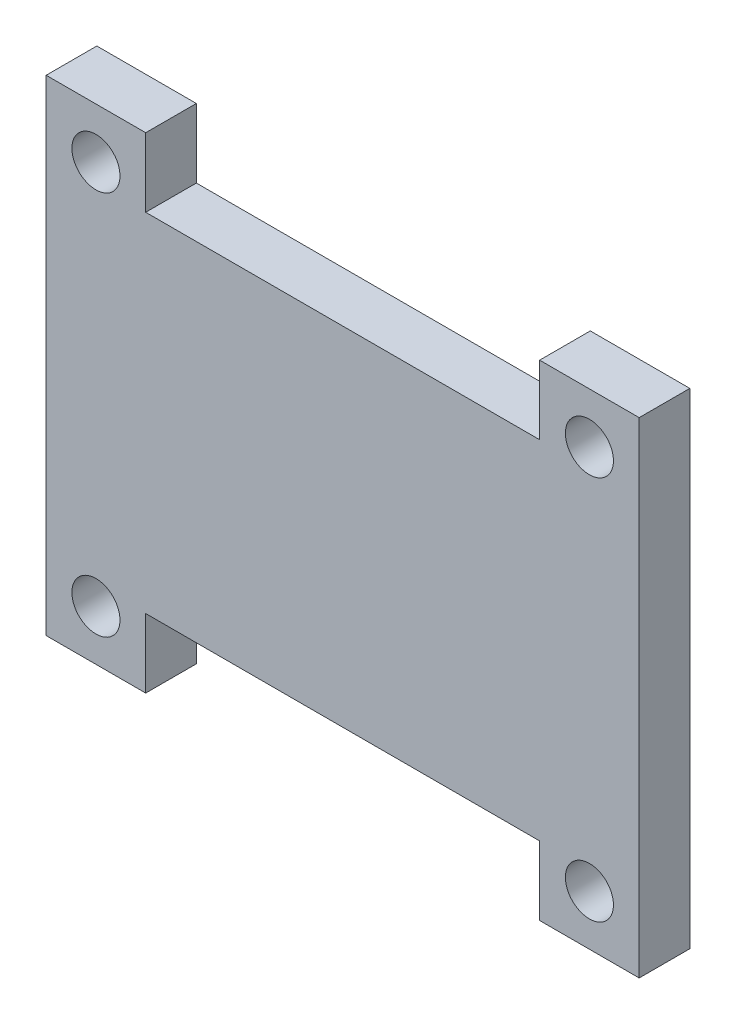
ISO-10303-21;
HEADER;
FILE_DESCRIPTION(('STEP AP214'),'2;1');
FILE_NAME('part.step','',(''),(''),'','','');
FILE_SCHEMA(('AUTOMOTIVE_DESIGN { 1 0 10303 214 1 1 1 1 }'));
ENDSEC;
DATA;
#1=APPLICATION_CONTEXT('core data for automotive mechanical design processes');
#2=APPLICATION_PROTOCOL_DEFINITION('international standard','automotive_design',2000,#1);
#3=PRODUCT_CONTEXT('',#1,'mechanical');
#4=PRODUCT('Part','Part','',(#3));
#5=PRODUCT_RELATED_PRODUCT_CATEGORY('part','',(#4));
#6=PRODUCT_DEFINITION_FORMATION('','',#4);
#7=PRODUCT_DEFINITION_CONTEXT('part definition',#1,'design');
#8=PRODUCT_DEFINITION('design','',#6,#7);
#9=PRODUCT_DEFINITION_SHAPE('','',#8);
#10=(LENGTH_UNIT() NAMED_UNIT(*) SI_UNIT(.MILLI.,.METRE.));
#11=(NAMED_UNIT(*) PLANE_ANGLE_UNIT() SI_UNIT($,.RADIAN.));
#12=(NAMED_UNIT(*) SI_UNIT($,.STERADIAN.) SOLID_ANGLE_UNIT());
#13=UNCERTAINTY_MEASURE_WITH_UNIT(LENGTH_MEASURE(1.E-05),#10,'distance_accuracy_value','');
#14=(GEOMETRIC_REPRESENTATION_CONTEXT(3) GLOBAL_UNCERTAINTY_ASSIGNED_CONTEXT((#13)) GLOBAL_UNIT_ASSIGNED_CONTEXT((#10,
#11,#12)) REPRESENTATION_CONTEXT('',''));
#15=CARTESIAN_POINT('',(0.,0.,0.));
#16=DIRECTION('',(0.,0.,1.));
#17=DIRECTION('',(1.,0.,0.));
#18=AXIS2_PLACEMENT_3D('',#15,#16,#17);
#19=CARTESIAN_POINT('',(-25.,-19.4444444444444,1.58));
#20=DIRECTION('',(0.,0.,1.));
#21=DIRECTION('',(1.,0.,0.));
#22=AXIS2_PLACEMENT_3D('',#19,#20,#21);
#23=PLANE('',#22);
#24=CARTESIAN_POINT('',(-8.0525,-17.8744444444445,1.58));
#25=DIRECTION('',(0.,0.,-1.));
#26=DIRECTION('',(0.,1.,0.));
#27=AXIS2_PLACEMENT_3D('',#24,#25,#26);
#28=CIRCLE('',#27,0.750000000000003);
#29=CARTESIAN_POINT('',(-8.0525,-17.1244444444445,1.58));
#30=VERTEX_POINT('',#29);
#31=EDGE_CURVE('E138',#30,#30,#28,.F.);
#32=ORIENTED_EDGE('',*,*,#31,.F.);
#33=EDGE_LOOP('',(#32));
#34=FACE_BOUND('',#33,.T.);
#35=CARTESIAN_POINT('',(-8.0525,-5.87444444444445,1.58));
#36=DIRECTION('',(0.,0.,-1.));
#37=DIRECTION('',(0.,1.,0.));
#38=AXIS2_PLACEMENT_3D('',#35,#36,#37);
#39=CIRCLE('',#38,0.750000000000003);
#40=CARTESIAN_POINT('',(-8.0525,-5.12444444444445,1.58));
#41=VERTEX_POINT('',#40);
#42=EDGE_CURVE('E142',#41,#41,#39,.F.);
#43=ORIENTED_EDGE('',*,*,#42,.F.);
#44=EDGE_LOOP('',(#43));
#45=FACE_BOUND('',#44,.T.);
#46=CARTESIAN_POINT('',(-23.4475,-17.8744444444445,1.58));
#47=DIRECTION('',(0.,0.,1.));
#48=DIRECTION('',(0.,-1.,0.));
#49=AXIS2_PLACEMENT_3D('',#46,#47,#48);
#50=CIRCLE('',#49,0.750000000000004);
#51=CARTESIAN_POINT('',(-23.4475,-18.6244444444445,1.58));
#52=VERTEX_POINT('',#51);
#53=EDGE_CURVE('E144',#52,#52,#50,.T.);
#54=ORIENTED_EDGE('',*,*,#53,.F.);
#55=EDGE_LOOP('',(#54));
#56=FACE_BOUND('',#55,.T.);
#57=CARTESIAN_POINT('',(-23.4475,-5.87444444444445,1.58));
#58=DIRECTION('',(0.,0.,1.));
#59=DIRECTION('',(0.,-1.,0.));
#60=AXIS2_PLACEMENT_3D('',#57,#58,#59);
#61=CIRCLE('',#60,0.750000000000004);
#62=CARTESIAN_POINT('',(-23.4475,-6.62444444444445,1.58));
#63=VERTEX_POINT('',#62);
#64=EDGE_CURVE('E20',#63,#63,#61,.T.);
#65=ORIENTED_EDGE('',*,*,#64,.F.);
#66=EDGE_LOOP('',(#65));
#67=FACE_BOUND('',#66,.T.);
#68=DIRECTION('',(0.,-1.,0.));
#69=VECTOR('',#68,1.);
#70=CARTESIAN_POINT('',(-6.5,-11.8744444444445,1.58));
#71=LINE('',#70,#69);
#72=CARTESIAN_POINT('',(-6.5,-4.30444444444445,1.58));
#73=VERTEX_POINT('',#72);
#74=CARTESIAN_POINT('',(-6.5,-19.4444444444444,1.58));
#75=VERTEX_POINT('',#74);
#76=EDGE_CURVE('E103',#73,#75,#71,.T.);
#77=ORIENTED_EDGE('',*,*,#76,.F.);
#78=DIRECTION('',(1.,0.,0.));
#79=VECTOR('',#78,1.);
#80=CARTESIAN_POINT('',(-8.0525,-4.30444444444445,1.58));
#81=LINE('',#80,#79);
#82=CARTESIAN_POINT('',(-9.60500000000001,-4.30444444444445,1.58));
#83=VERTEX_POINT('',#82);
#84=EDGE_CURVE('E118',#83,#73,#81,.T.);
#85=ORIENTED_EDGE('',*,*,#84,.F.);
#86=DIRECTION('',(0.,1.,0.));
#87=VECTOR('',#86,1.);
#88=CARTESIAN_POINT('',(-9.605,-5.37944444444445,1.57999999999999));
#89=LINE('',#88,#87);
#90=CARTESIAN_POINT('',(-9.60500000000002,-6.45444444444446,1.58));
#91=VERTEX_POINT('',#90);
#92=EDGE_CURVE('E108',#91,#83,#89,.T.);
#93=ORIENTED_EDGE('',*,*,#92,.F.);
#94=DIRECTION('',(1.,0.,0.));
#95=VECTOR('',#94,1.);
#96=CARTESIAN_POINT('',(-15.75,-6.45444444444445,1.58));
#97=LINE('',#96,#95);
#98=CARTESIAN_POINT('',(-21.895,-6.45444444444446,1.58));
#99=VERTEX_POINT('',#98);
#100=EDGE_CURVE('E151',#99,#91,#97,.T.);
#101=ORIENTED_EDGE('',*,*,#100,.F.);
#102=DIRECTION('',(0.,-1.,0.));
#103=VECTOR('',#102,1.);
#104=CARTESIAN_POINT('',(-21.895,-5.37944444444445,1.58));
#105=LINE('',#104,#103);
#106=CARTESIAN_POINT('',(-21.895,-4.30444444444445,1.58));
#107=VERTEX_POINT('',#106);
#108=EDGE_CURVE('E160',#107,#99,#105,.T.);
#109=ORIENTED_EDGE('',*,*,#108,.F.);
#110=DIRECTION('',(1.,0.,0.));
#111=VECTOR('',#110,1.);
#112=CARTESIAN_POINT('',(-23.4475,-4.30444444444445,1.58));
#113=LINE('',#112,#111);
#114=CARTESIAN_POINT('',(-25.,-4.30444444444445,1.58));
#115=VERTEX_POINT('',#114);
#116=EDGE_CURVE('E165',#115,#107,#113,.T.);
#117=ORIENTED_EDGE('',*,*,#116,.F.);
#118=DIRECTION('',(0.,1.,0.));
#119=VECTOR('',#118,1.);
#120=CARTESIAN_POINT('',(-25.,-11.8744444444445,1.58));
#121=LINE('',#120,#119);
#122=CARTESIAN_POINT('',(-25.,-19.4444444444444,1.58));
#123=VERTEX_POINT('',#122);
#124=EDGE_CURVE('E173',#123,#115,#121,.T.);
#125=ORIENTED_EDGE('',*,*,#124,.F.);
#126=DIRECTION('',(-1.,0.,0.));
#127=VECTOR('',#126,1.);
#128=CARTESIAN_POINT('',(-23.4475,-19.4444444444444,1.58));
#129=LINE('',#128,#127);
#130=CARTESIAN_POINT('',(-21.895,-19.4444444444444,1.57999999999999));
#131=VERTEX_POINT('',#130);
#132=EDGE_CURVE('E175',#131,#123,#129,.T.);
#133=ORIENTED_EDGE('',*,*,#132,.F.);
#134=DIRECTION('',(0.,-1.,0.));
#135=VECTOR('',#134,1.);
#136=CARTESIAN_POINT('',(-21.895,-18.3694444444444,1.57999999999997));
#137=LINE('',#136,#135);
#138=CARTESIAN_POINT('',(-21.895,-17.2944444444444,1.57999999999999));
#139=VERTEX_POINT('',#138);
#140=EDGE_CURVE('E181',#139,#131,#137,.T.);
#141=ORIENTED_EDGE('',*,*,#140,.F.);
#142=DIRECTION('',(-1.,0.,0.));
#143=VECTOR('',#142,1.);
#144=CARTESIAN_POINT('',(-15.75,-17.2944444444445,1.58));
#145=LINE('',#144,#143);
#146=CARTESIAN_POINT('',(-9.60500000000001,-17.2944444444444,1.57999999999998));
#147=VERTEX_POINT('',#146);
#148=EDGE_CURVE('E186',#147,#139,#145,.T.);
#149=ORIENTED_EDGE('',*,*,#148,.F.);
#150=DIRECTION('',(0.,1.,0.));
#151=VECTOR('',#150,1.);
#152=CARTESIAN_POINT('',(-9.605,-18.3694444444445,1.57999999999996));
#153=LINE('',#152,#151);
#154=CARTESIAN_POINT('',(-9.60500000000001,-19.4444444444444,1.57999999999999));
#155=VERTEX_POINT('',#154);
#156=EDGE_CURVE('E191',#155,#147,#153,.T.);
#157=ORIENTED_EDGE('',*,*,#156,.F.);
#158=DIRECTION('',(-1.,0.,0.));
#159=VECTOR('',#158,1.);
#160=CARTESIAN_POINT('',(-8.0525,-19.4444444444444,1.58));
#161=LINE('',#160,#159);
#162=EDGE_CURVE('E196',#75,#155,#161,.T.);
#163=ORIENTED_EDGE('',*,*,#162,.F.);
#164=EDGE_LOOP('',(#77,#85,#93,#101,#109,#117,#125,#133,#141,#149,#157,#163));
#165=FACE_BOUND('',#164,.T.);
#166=ADVANCED_FACE('F17',(#34,#45,#56,#67,#165),#23,.T.);
#167=CARTESIAN_POINT('',(-9.605,-6.45444444444445,1.57999999999999));
#168=DIRECTION('',(-1.,0.,0.));
#169=DIRECTION('',(0.,1.,0.));
#170=AXIS2_PLACEMENT_3D('',#167,#168,#169);
#171=PLANE('',#170);
#172=ORIENTED_EDGE('',*,*,#92,.T.);
#173=DIRECTION('',(0.,0.,1.));
#174=VECTOR('',#173,1.);
#175=CARTESIAN_POINT('',(-9.605,-4.30444444444445,0.));
#176=LINE('',#175,#174);
#177=CARTESIAN_POINT('',(-9.605,-4.30444444444445,0.));
#178=VERTEX_POINT('',#177);
#179=EDGE_CURVE('E111',#178,#83,#176,.T.);
#180=ORIENTED_EDGE('',*,*,#179,.F.);
#181=DIRECTION('',(0.,1.,0.));
#182=VECTOR('',#181,1.);
#183=CARTESIAN_POINT('',(-9.605,-19.4444444444444,0.));
#184=LINE('',#183,#182);
#185=CARTESIAN_POINT('',(-9.605,-6.45444444444445,0.));
#186=VERTEX_POINT('',#185);
#187=EDGE_CURVE('E141',#186,#178,#184,.T.);
#188=ORIENTED_EDGE('',*,*,#187,.F.);
#189=DIRECTION('',(0.,0.,-1.));
#190=VECTOR('',#189,1.);
#191=CARTESIAN_POINT('',(-9.605,-6.45444444444445,1.58));
#192=LINE('',#191,#190);
#193=EDGE_CURVE('E114',#91,#186,#192,.T.);
#194=ORIENTED_EDGE('',*,*,#193,.F.);
#195=EDGE_LOOP('',(#172,#180,#188,#194));
#196=FACE_BOUND('',#195,.T.);
#197=ADVANCED_FACE('F109',(#196),#171,.T.);
#198=CARTESIAN_POINT('',(-6.5,-4.30444444444445,0.));
#199=DIRECTION('',(0.,1.,0.));
#200=DIRECTION('',(-1.,0.,0.));
#201=AXIS2_PLACEMENT_3D('',#198,#199,#200);
#202=PLANE('',#201);
#203=DIRECTION('',(0.,0.,1.));
#204=VECTOR('',#203,1.);
#205=CARTESIAN_POINT('',(-6.5,-4.30444444444445,0.));
#206=LINE('',#205,#204);
#207=CARTESIAN_POINT('',(-6.5,-4.30444444444445,0.));
#208=VERTEX_POINT('',#207);
#209=EDGE_CURVE('E201',#208,#73,#206,.T.);
#210=ORIENTED_EDGE('',*,*,#209,.F.);
#211=DIRECTION('',(1.,0.,0.));
#212=VECTOR('',#211,1.);
#213=CARTESIAN_POINT('',(-15.75,-4.30444444444445,0.));
#214=LINE('',#213,#212);
#215=EDGE_CURVE('E124',#178,#208,#214,.T.);
#216=ORIENTED_EDGE('',*,*,#215,.F.);
#217=ORIENTED_EDGE('',*,*,#179,.T.);
#218=ORIENTED_EDGE('',*,*,#84,.T.);
#219=EDGE_LOOP('',(#210,#216,#217,#218));
#220=FACE_BOUND('',#219,.T.);
#221=ADVANCED_FACE('F122',(#220),#202,.T.);
#222=CARTESIAN_POINT('',(-6.5,-19.4444444444444,0.));
#223=DIRECTION('',(1.,0.,0.));
#224=DIRECTION('',(0.,1.,0.));
#225=AXIS2_PLACEMENT_3D('',#222,#223,#224);
#226=PLANE('',#225);
#227=DIRECTION('',(0.,1.,0.));
#228=VECTOR('',#227,1.);
#229=CARTESIAN_POINT('',(-6.5,-19.4444444444444,0.));
#230=LINE('',#229,#228);
#231=CARTESIAN_POINT('',(-6.5,-19.4444444444444,0.));
#232=VERTEX_POINT('',#231);
#233=EDGE_CURVE('E217',#208,#232,#230,.F.);
#234=ORIENTED_EDGE('',*,*,#233,.F.);
#235=ORIENTED_EDGE('',*,*,#209,.T.);
#236=ORIENTED_EDGE('',*,*,#76,.T.);
#237=DIRECTION('',(0.,0.,1.));
#238=VECTOR('',#237,1.);
#239=CARTESIAN_POINT('',(-6.5,-19.4444444444444,0.));
#240=LINE('',#239,#238);
#241=EDGE_CURVE('E198',#232,#75,#240,.T.);
#242=ORIENTED_EDGE('',*,*,#241,.F.);
#243=EDGE_LOOP('',(#234,#235,#236,#242));
#244=FACE_BOUND('',#243,.T.);
#245=ADVANCED_FACE('F204',(#244),#226,.T.);
#246=CARTESIAN_POINT('',(-9.605,-19.4444444444444,0.));
#247=DIRECTION('',(0.,-1.,0.));
#248=DIRECTION('',(1.,0.,0.));
#249=AXIS2_PLACEMENT_3D('',#246,#247,#248);
#250=PLANE('',#249);
#251=ORIENTED_EDGE('',*,*,#241,.T.);
#252=ORIENTED_EDGE('',*,*,#162,.T.);
#253=DIRECTION('',(0.,0.,-1.));
#254=VECTOR('',#253,1.);
#255=CARTESIAN_POINT('',(-9.605,-19.4444444444444,1.58000000000001));
#256=LINE('',#255,#254);
#257=CARTESIAN_POINT('',(-9.605,-19.4444444444444,0.));
#258=VERTEX_POINT('',#257);
#259=EDGE_CURVE('E193',#258,#155,#256,.F.);
#260=ORIENTED_EDGE('',*,*,#259,.F.);
#261=DIRECTION('',(-1.,0.,0.));
#262=VECTOR('',#261,1.);
#263=CARTESIAN_POINT('',(-15.75,-19.4444444444444,0.));
#264=LINE('',#263,#262);
#265=EDGE_CURVE('E211',#232,#258,#264,.T.);
#266=ORIENTED_EDGE('',*,*,#265,.F.);
#267=EDGE_LOOP('',(#251,#252,#260,#266));
#268=FACE_BOUND('',#267,.T.);
#269=ADVANCED_FACE('F209',(#268),#250,.T.);
#270=CARTESIAN_POINT('',(-9.605,-19.4444444444444,1.57999999999997));
#271=DIRECTION('',(-1.,0.,0.));
#272=DIRECTION('',(0.,1.,0.));
#273=AXIS2_PLACEMENT_3D('',#270,#271,#272);
#274=PLANE('',#273);
#275=ORIENTED_EDGE('',*,*,#156,.T.);
#276=DIRECTION('',(0.,0.,-1.));
#277=VECTOR('',#276,1.);
#278=CARTESIAN_POINT('',(-9.605,-17.2944444444445,1.58));
#279=LINE('',#278,#277);
#280=CARTESIAN_POINT('',(-9.605,-17.2944444444445,0.));
#281=VERTEX_POINT('',#280);
#282=EDGE_CURVE('E188',#281,#147,#279,.F.);
#283=ORIENTED_EDGE('',*,*,#282,.F.);
#284=DIRECTION('',(0.,1.,0.));
#285=VECTOR('',#284,1.);
#286=CARTESIAN_POINT('',(-9.605,-19.4444444444444,0.));
#287=LINE('',#286,#285);
#288=EDGE_CURVE('E216',#258,#281,#287,.T.);
#289=ORIENTED_EDGE('',*,*,#288,.F.);
#290=ORIENTED_EDGE('',*,*,#259,.T.);
#291=EDGE_LOOP('',(#275,#283,#289,#290));
#292=FACE_BOUND('',#291,.T.);
#293=ADVANCED_FACE('F263',(#292),#274,.T.);
#294=CARTESIAN_POINT('',(-9.605,-17.2944444444445,1.58));
#295=DIRECTION('',(0.,-1.,0.));
#296=DIRECTION('',(-1.,0.,0.));
#297=AXIS2_PLACEMENT_3D('',#294,#295,#296);
#298=PLANE('',#297);
#299=ORIENTED_EDGE('',*,*,#148,.T.);
#300=DIRECTION('',(0.,0.,-1.));
#301=VECTOR('',#300,1.);
#302=CARTESIAN_POINT('',(-21.895,-17.2944444444445,1.57999999999999));
#303=LINE('',#302,#301);
#304=CARTESIAN_POINT('',(-21.895,-17.2944444444445,0.));
#305=VERTEX_POINT('',#304);
#306=EDGE_CURVE('E183',#305,#139,#303,.F.);
#307=ORIENTED_EDGE('',*,*,#306,.F.);
#308=DIRECTION('',(-1.,0.,0.));
#309=VECTOR('',#308,1.);
#310=CARTESIAN_POINT('',(-15.75,-17.2944444444445,0.));
#311=LINE('',#310,#309);
#312=EDGE_CURVE('E224',#281,#305,#311,.T.);
#313=ORIENTED_EDGE('',*,*,#312,.F.);
#314=ORIENTED_EDGE('',*,*,#282,.T.);
#315=EDGE_LOOP('',(#299,#307,#313,#314));
#316=FACE_BOUND('',#315,.T.);
#317=ADVANCED_FACE('F261',(#316),#298,.T.);
#318=CARTESIAN_POINT('',(-21.895,-17.2944444444445,1.57999999999997));
#319=DIRECTION('',(1.,0.,0.));
#320=DIRECTION('',(0.,-1.,0.));
#321=AXIS2_PLACEMENT_3D('',#318,#319,#320);
#322=PLANE('',#321);
#323=ORIENTED_EDGE('',*,*,#140,.T.);
#324=DIRECTION('',(0.,0.,1.));
#325=VECTOR('',#324,1.);
#326=CARTESIAN_POINT('',(-21.895,-19.4444444444444,0.));
#327=LINE('',#326,#325);
#328=CARTESIAN_POINT('',(-21.895,-19.4444444444444,0.));
#329=VERTEX_POINT('',#328);
#330=EDGE_CURVE('E178',#329,#131,#327,.T.);
#331=ORIENTED_EDGE('',*,*,#330,.F.);
#332=DIRECTION('',(0.,1.,0.));
#333=VECTOR('',#332,1.);
#334=CARTESIAN_POINT('',(-21.895,-19.4444444444444,0.));
#335=LINE('',#334,#333);
#336=EDGE_CURVE('E227',#305,#329,#335,.F.);
#337=ORIENTED_EDGE('',*,*,#336,.F.);
#338=ORIENTED_EDGE('',*,*,#306,.T.);
#339=EDGE_LOOP('',(#323,#331,#337,#338));
#340=FACE_BOUND('',#339,.T.);
#341=ADVANCED_FACE('F258',(#340),#322,.T.);
#342=CARTESIAN_POINT('',(-25.,-19.4444444444444,0.));
#343=DIRECTION('',(0.,-1.,0.));
#344=DIRECTION('',(1.,0.,0.));
#345=AXIS2_PLACEMENT_3D('',#342,#343,#344);
#346=PLANE('',#345);
#347=DIRECTION('',(0.,0.,1.));
#348=VECTOR('',#347,1.);
#349=CARTESIAN_POINT('',(-25.,-19.4444444444444,0.));
#350=LINE('',#349,#348);
#351=CARTESIAN_POINT('',(-25.,-19.4444444444444,0.));
#352=VERTEX_POINT('',#351);
#353=EDGE_CURVE('E170',#352,#123,#350,.T.);
#354=ORIENTED_EDGE('',*,*,#353,.F.);
#355=DIRECTION('',(-1.,0.,0.));
#356=VECTOR('',#355,1.);
#357=CARTESIAN_POINT('',(-15.75,-19.4444444444444,0.));
#358=LINE('',#357,#356);
#359=EDGE_CURVE('E230',#329,#352,#358,.T.);
#360=ORIENTED_EDGE('',*,*,#359,.F.);
#361=ORIENTED_EDGE('',*,*,#330,.T.);
#362=ORIENTED_EDGE('',*,*,#132,.T.);
#363=EDGE_LOOP('',(#354,#360,#361,#362));
#364=FACE_BOUND('',#363,.T.);
#365=ADVANCED_FACE('F254',(#364),#346,.T.);
#366=CARTESIAN_POINT('',(-25.,-4.30444444444445,0.));
#367=DIRECTION('',(-1.,0.,0.));
#368=DIRECTION('',(0.,-1.,0.));
#369=AXIS2_PLACEMENT_3D('',#366,#367,#368);
#370=PLANE('',#369);
#371=DIRECTION('',(0.,1.,0.));
#372=VECTOR('',#371,1.);
#373=CARTESIAN_POINT('',(-25.,-19.4444444444444,0.));
#374=LINE('',#373,#372);
#375=CARTESIAN_POINT('',(-25.,-4.30444444444445,0.));
#376=VERTEX_POINT('',#375);
#377=EDGE_CURVE('E233',#352,#376,#374,.T.);
#378=ORIENTED_EDGE('',*,*,#377,.F.);
#379=ORIENTED_EDGE('',*,*,#353,.T.);
#380=ORIENTED_EDGE('',*,*,#124,.T.);
#381=DIRECTION('',(0.,0.,1.));
#382=VECTOR('',#381,1.);
#383=CARTESIAN_POINT('',(-25.,-4.30444444444445,0.));
#384=LINE('',#383,#382);
#385=EDGE_CURVE('E167',#376,#115,#384,.T.);
#386=ORIENTED_EDGE('',*,*,#385,.F.);
#387=EDGE_LOOP('',(#378,#379,#380,#386));
#388=FACE_BOUND('',#387,.T.);
#389=ADVANCED_FACE('F250',(#388),#370,.T.);
#390=CARTESIAN_POINT('',(-21.895,-4.30444444444445,0.));
#391=DIRECTION('',(0.,1.,0.));
#392=DIRECTION('',(-1.,0.,0.));
#393=AXIS2_PLACEMENT_3D('',#390,#391,#392);
#394=PLANE('',#393);
#395=ORIENTED_EDGE('',*,*,#385,.T.);
#396=ORIENTED_EDGE('',*,*,#116,.T.);
#397=DIRECTION('',(0.,0.,-1.));
#398=VECTOR('',#397,1.);
#399=CARTESIAN_POINT('',(-21.895,-4.30444444444445,1.58000000000001));
#400=LINE('',#399,#398);
#401=CARTESIAN_POINT('',(-21.895,-4.30444444444445,0.));
#402=VERTEX_POINT('',#401);
#403=EDGE_CURVE('E162',#402,#107,#400,.F.);
#404=ORIENTED_EDGE('',*,*,#403,.F.);
#405=DIRECTION('',(1.,0.,0.));
#406=VECTOR('',#405,1.);
#407=CARTESIAN_POINT('',(-15.75,-4.30444444444445,0.));
#408=LINE('',#407,#406);
#409=EDGE_CURVE('E236',#376,#402,#408,.T.);
#410=ORIENTED_EDGE('',*,*,#409,.F.);
#411=EDGE_LOOP('',(#395,#396,#404,#410));
#412=FACE_BOUND('',#411,.T.);
#413=ADVANCED_FACE('F247',(#412),#394,.T.);
#414=CARTESIAN_POINT('',(-21.895,-4.30444444444445,1.58000000000001));
#415=DIRECTION('',(1.,0.,0.));
#416=DIRECTION('',(0.,-1.,0.));
#417=AXIS2_PLACEMENT_3D('',#414,#415,#416);
#418=PLANE('',#417);
#419=ORIENTED_EDGE('',*,*,#108,.T.);
#420=DIRECTION('',(0.,0.,-1.));
#421=VECTOR('',#420,1.);
#422=CARTESIAN_POINT('',(-21.895,-6.45444444444445,1.58));
#423=LINE('',#422,#421);
#424=CARTESIAN_POINT('',(-21.895,-6.45444444444445,0.));
#425=VERTEX_POINT('',#424);
#426=EDGE_CURVE('E35',#425,#99,#423,.F.);
#427=ORIENTED_EDGE('',*,*,#426,.F.);
#428=DIRECTION('',(0.,1.,0.));
#429=VECTOR('',#428,1.);
#430=CARTESIAN_POINT('',(-21.895,-19.4444444444444,0.));
#431=LINE('',#430,#429);
#432=EDGE_CURVE('E239',#402,#425,#431,.F.);
#433=ORIENTED_EDGE('',*,*,#432,.F.);
#434=ORIENTED_EDGE('',*,*,#403,.T.);
#435=EDGE_LOOP('',(#419,#427,#433,#434));
#436=FACE_BOUND('',#435,.T.);
#437=ADVANCED_FACE('F244',(#436),#418,.T.);
#438=CARTESIAN_POINT('',(-21.895,-6.45444444444445,1.58));
#439=DIRECTION('',(0.,1.,0.));
#440=DIRECTION('',(1.,0.,0.));
#441=AXIS2_PLACEMENT_3D('',#438,#439,#440);
#442=PLANE('',#441);
#443=ORIENTED_EDGE('',*,*,#100,.T.);
#444=ORIENTED_EDGE('',*,*,#193,.T.);
#445=DIRECTION('',(1.,0.,0.));
#446=VECTOR('',#445,1.);
#447=CARTESIAN_POINT('',(-15.75,-6.45444444444445,0.));
#448=LINE('',#447,#446);
#449=EDGE_CURVE('E137',#425,#186,#448,.T.);
#450=ORIENTED_EDGE('',*,*,#449,.F.);
#451=ORIENTED_EDGE('',*,*,#426,.T.);
#452=EDGE_LOOP('',(#443,#444,#450,#451));
#453=FACE_BOUND('',#452,.T.);
#454=ADVANCED_FACE('F241',(#453),#442,.T.);
#455=CARTESIAN_POINT('',(-23.4475,-5.87444444444446,0.));
#456=DIRECTION('',(0.,0.,1.));
#457=DIRECTION('',(0.,-1.,0.));
#458=AXIS2_PLACEMENT_3D('',#455,#456,#457);
#459=CYLINDRICAL_SURFACE('',#458,0.750000000000004);
#460=CARTESIAN_POINT('',(-23.4475,-5.87444444444446,0.));
#461=DIRECTION('',(0.,0.,1.));
#462=DIRECTION('',(0.,-1.,0.));
#463=AXIS2_PLACEMENT_3D('',#460,#461,#462);
#464=CIRCLE('',#463,0.750000000000004);
#465=CARTESIAN_POINT('',(-23.4475,-6.62444444444446,0.));
#466=VERTEX_POINT('',#465);
#467=EDGE_CURVE('E134',#466,#466,#464,.T.);
#468=ORIENTED_EDGE('',*,*,#467,.F.);
#469=EDGE_LOOP('',(#468));
#470=FACE_BOUND('',#469,.T.);
#471=ORIENTED_EDGE('',*,*,#64,.T.);
#472=EDGE_LOOP('',(#471));
#473=FACE_BOUND('',#472,.T.);
#474=ADVANCED_FACE('F291',(#470,#473),#459,.F.);
#475=CARTESIAN_POINT('',(-23.4475,-17.8744444444445,0.));
#476=DIRECTION('',(0.,0.,1.));
#477=DIRECTION('',(0.,-1.,0.));
#478=AXIS2_PLACEMENT_3D('',#475,#476,#477);
#479=CYLINDRICAL_SURFACE('',#478,0.750000000000004);
#480=CARTESIAN_POINT('',(-23.4475,-17.8744444444445,0.));
#481=DIRECTION('',(0.,0.,1.));
#482=DIRECTION('',(0.,-1.,0.));
#483=AXIS2_PLACEMENT_3D('',#480,#481,#482);
#484=CIRCLE('',#483,0.750000000000004);
#485=CARTESIAN_POINT('',(-23.4475,-18.6244444444445,0.));
#486=VERTEX_POINT('',#485);
#487=EDGE_CURVE('E131',#486,#486,#484,.T.);
#488=ORIENTED_EDGE('',*,*,#487,.F.);
#489=EDGE_LOOP('',(#488));
#490=FACE_BOUND('',#489,.T.);
#491=ORIENTED_EDGE('',*,*,#53,.T.);
#492=EDGE_LOOP('',(#491));
#493=FACE_BOUND('',#492,.T.);
#494=ADVANCED_FACE('F287',(#490,#493),#479,.F.);
#495=CARTESIAN_POINT('',(-8.0525,-5.87444444444445,1.58));
#496=DIRECTION('',(0.,0.,-1.));
#497=DIRECTION('',(0.,1.,0.));
#498=AXIS2_PLACEMENT_3D('',#495,#496,#497);
#499=CYLINDRICAL_SURFACE('',#498,0.750000000000003);
#500=CARTESIAN_POINT('',(-8.0525,-5.87444444444446,0.));
#501=DIRECTION('',(0.,0.,-1.));
#502=DIRECTION('',(0.,1.,0.));
#503=AXIS2_PLACEMENT_3D('',#500,#501,#502);
#504=CIRCLE('',#503,0.750000000000003);
#505=CARTESIAN_POINT('',(-8.0525,-5.12444444444445,0.));
#506=VERTEX_POINT('',#505);
#507=EDGE_CURVE('E26',#506,#506,#504,.F.);
#508=ORIENTED_EDGE('',*,*,#507,.F.);
#509=EDGE_LOOP('',(#508));
#510=FACE_BOUND('',#509,.T.);
#511=ORIENTED_EDGE('',*,*,#42,.T.);
#512=EDGE_LOOP('',(#511));
#513=FACE_BOUND('',#512,.T.);
#514=ADVANCED_FACE('F280',(#510,#513),#499,.F.);
#515=CARTESIAN_POINT('',(-8.0525,-17.8744444444445,1.58));
#516=DIRECTION('',(0.,0.,-1.));
#517=DIRECTION('',(0.,1.,0.));
#518=AXIS2_PLACEMENT_3D('',#515,#516,#517);
#519=CYLINDRICAL_SURFACE('',#518,0.750000000000003);
#520=CARTESIAN_POINT('',(-8.0525,-17.8744444444445,0.));
#521=DIRECTION('',(0.,0.,-1.));
#522=DIRECTION('',(0.,1.,0.));
#523=AXIS2_PLACEMENT_3D('',#520,#521,#522);
#524=CIRCLE('',#523,0.750000000000003);
#525=CARTESIAN_POINT('',(-8.0525,-17.1244444444445,0.));
#526=VERTEX_POINT('',#525);
#527=EDGE_CURVE('E11',#526,#526,#524,.F.);
#528=ORIENTED_EDGE('',*,*,#527,.F.);
#529=EDGE_LOOP('',(#528));
#530=FACE_BOUND('',#529,.T.);
#531=ORIENTED_EDGE('',*,*,#31,.T.);
#532=EDGE_LOOP('',(#531));
#533=FACE_BOUND('',#532,.T.);
#534=ADVANCED_FACE('F274',(#530,#533),#519,.F.);
#535=CARTESIAN_POINT('',(-6.5,-19.4444444444445,0.));
#536=DIRECTION('',(0.,0.,-1.));
#537=DIRECTION('',(-1.,0.,0.));
#538=AXIS2_PLACEMENT_3D('',#535,#536,#537);
#539=PLANE('',#538);
#540=ORIENTED_EDGE('',*,*,#527,.T.);
#541=EDGE_LOOP('',(#540));
#542=FACE_BOUND('',#541,.T.);
#543=ORIENTED_EDGE('',*,*,#507,.T.);
#544=EDGE_LOOP('',(#543));
#545=FACE_BOUND('',#544,.T.);
#546=ORIENTED_EDGE('',*,*,#487,.T.);
#547=EDGE_LOOP('',(#546));
#548=FACE_BOUND('',#547,.T.);
#549=ORIENTED_EDGE('',*,*,#467,.T.);
#550=EDGE_LOOP('',(#549));
#551=FACE_BOUND('',#550,.T.);
#552=ORIENTED_EDGE('',*,*,#432,.T.);
#553=ORIENTED_EDGE('',*,*,#449,.T.);
#554=ORIENTED_EDGE('',*,*,#187,.T.);
#555=ORIENTED_EDGE('',*,*,#215,.T.);
#556=ORIENTED_EDGE('',*,*,#233,.T.);
#557=ORIENTED_EDGE('',*,*,#265,.T.);
#558=ORIENTED_EDGE('',*,*,#288,.T.);
#559=ORIENTED_EDGE('',*,*,#312,.T.);
#560=ORIENTED_EDGE('',*,*,#336,.T.);
#561=ORIENTED_EDGE('',*,*,#359,.T.);
#562=ORIENTED_EDGE('',*,*,#377,.T.);
#563=ORIENTED_EDGE('',*,*,#409,.T.);
#564=EDGE_LOOP('',(#552,#553,#554,#555,#556,#557,#558,#559,#560,#561,#562,#563));
#565=FACE_BOUND('',#564,.T.);
#566=ADVANCED_FACE('F220',(#542,#545,#548,#551,#565),#539,.T.);
#567=CLOSED_SHELL('',(#166,#197,#221,#245,#269,#293,#317,#341,#365,#389,#413,#437,#454,#474,
#494,#514,#534,#566));
#568=MANIFOLD_SOLID_BREP('B1',#567);
#569=ADVANCED_BREP_SHAPE_REPRESENTATION('',(#18,#568),#14);
#570=SHAPE_DEFINITION_REPRESENTATION(#9,#569);
ENDSEC;
END-ISO-10303-21;
